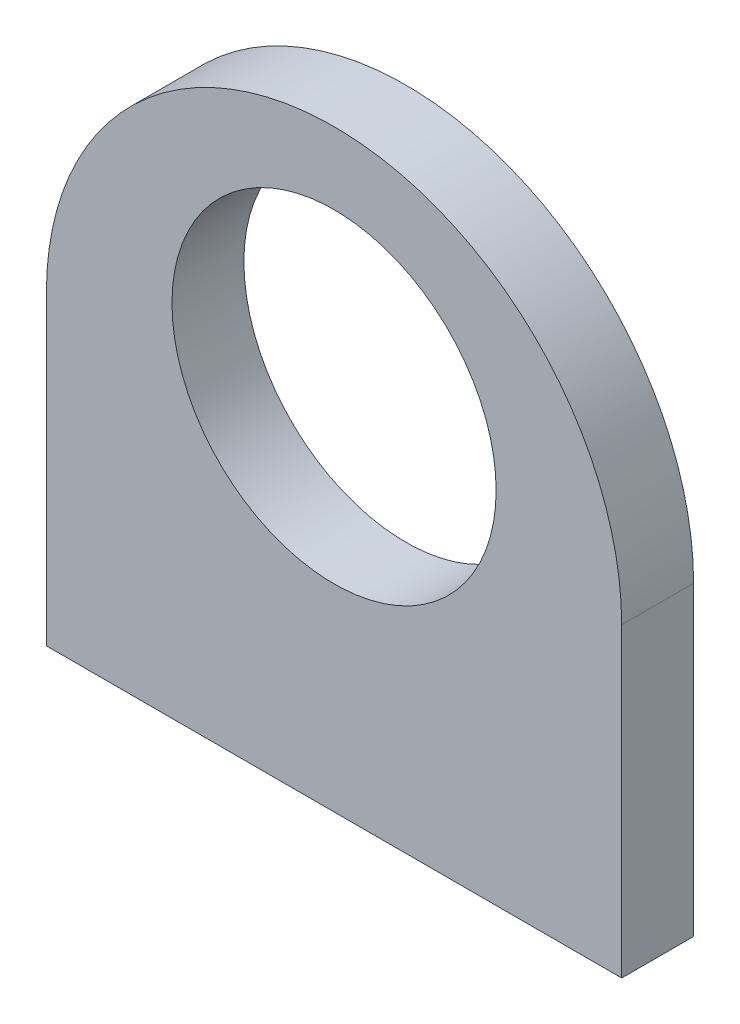
ISO-10303-21;
HEADER;
FILE_DESCRIPTION(('STEP AP214'),'2;1');
FILE_NAME('part.step','',(''),(''),'','','');
FILE_SCHEMA(('AUTOMOTIVE_DESIGN { 1 0 10303 214 1 1 1 1 }'));
ENDSEC;
DATA;
#1=APPLICATION_CONTEXT('core data for automotive mechanical design processes');
#2=APPLICATION_PROTOCOL_DEFINITION('international standard','automotive_design',2000,#1);
#3=PRODUCT_CONTEXT('',#1,'mechanical');
#4=PRODUCT('Part','Part','',(#3));
#5=PRODUCT_RELATED_PRODUCT_CATEGORY('part','',(#4));
#6=PRODUCT_DEFINITION_FORMATION('','',#4);
#7=PRODUCT_DEFINITION_CONTEXT('part definition',#1,'design');
#8=PRODUCT_DEFINITION('design','',#6,#7);
#9=PRODUCT_DEFINITION_SHAPE('','',#8);
#10=(LENGTH_UNIT() NAMED_UNIT(*) SI_UNIT(.MILLI.,.METRE.));
#11=(NAMED_UNIT(*) PLANE_ANGLE_UNIT() SI_UNIT($,.RADIAN.));
#12=(NAMED_UNIT(*) SI_UNIT($,.STERADIAN.) SOLID_ANGLE_UNIT());
#13=UNCERTAINTY_MEASURE_WITH_UNIT(LENGTH_MEASURE(1.E-05),#10,'distance_accuracy_value','');
#14=(GEOMETRIC_REPRESENTATION_CONTEXT(3) GLOBAL_UNCERTAINTY_ASSIGNED_CONTEXT((#13)) GLOBAL_UNIT_ASSIGNED_CONTEXT((#10,
#11,#12)) REPRESENTATION_CONTEXT('',''));
#15=CARTESIAN_POINT('',(0.,0.,0.));
#16=DIRECTION('',(0.,0.,1.));
#17=DIRECTION('',(1.,0.,0.));
#18=AXIS2_PLACEMENT_3D('',#15,#16,#17);
#19=CARTESIAN_POINT('',(25.4,27.0129,6.35));
#20=DIRECTION('',(0.,0.,1.));
#21=DIRECTION('',(1.,0.,0.));
#22=AXIS2_PLACEMENT_3D('',#19,#20,#21);
#23=PLANE('',#22);
#24=DIRECTION('',(0.,-1.,0.));
#25=VECTOR('',#24,1.);
#26=CARTESIAN_POINT('',(0.,0.,6.35));
#27=LINE('',#26,#25);
#28=CARTESIAN_POINT('',(0.,27.0129,6.35));
#29=VERTEX_POINT('',#28);
#30=CARTESIAN_POINT('',(0.,0.,6.35));
#31=VERTEX_POINT('',#30);
#32=EDGE_CURVE('E91',#29,#31,#27,.T.);
#33=ORIENTED_EDGE('',*,*,#32,.T.);
#34=DIRECTION('',(1.,0.,0.));
#35=VECTOR('',#34,1.);
#36=CARTESIAN_POINT('',(0.,0.,6.35));
#37=LINE('',#36,#35);
#38=CARTESIAN_POINT('',(50.8,0.,6.35));
#39=VERTEX_POINT('',#38);
#40=EDGE_CURVE('E86',#31,#39,#37,.T.);
#41=ORIENTED_EDGE('',*,*,#40,.T.);
#42=DIRECTION('',(0.,1.,0.));
#43=VECTOR('',#42,1.);
#44=CARTESIAN_POINT('',(50.8,0.,6.35));
#45=LINE('',#44,#43);
#46=CARTESIAN_POINT('',(50.8,27.0129,6.35));
#47=VERTEX_POINT('',#46);
#48=EDGE_CURVE('E89',#39,#47,#45,.T.);
#49=ORIENTED_EDGE('',*,*,#48,.T.);
#50=CARTESIAN_POINT('',(25.4,27.0129,6.35));
#51=DIRECTION('',(0.,0.,1.));
#52=DIRECTION('',(1.,0.,0.));
#53=AXIS2_PLACEMENT_3D('',#50,#51,#52);
#54=CIRCLE('',#53,25.4);
#55=EDGE_CURVE('E56',#47,#29,#54,.T.);
#56=ORIENTED_EDGE('',*,*,#55,.T.);
#57=EDGE_LOOP('',(#33,#41,#49,#56));
#58=FACE_BOUND('',#57,.T.);
#59=CARTESIAN_POINT('',(25.4,31.75,6.35));
#60=DIRECTION('',(0.,0.,1.));
#61=DIRECTION('',(1.,0.,0.));
#62=AXIS2_PLACEMENT_3D('',#59,#60,#61);
#63=CIRCLE('',#62,14.3129);
#64=CARTESIAN_POINT('',(39.7129,31.75,6.35));
#65=VERTEX_POINT('',#64);
#66=EDGE_CURVE('E106',#65,#65,#63,.T.);
#67=ORIENTED_EDGE('',*,*,#66,.F.);
#68=EDGE_LOOP('',(#67));
#69=FACE_BOUND('',#68,.T.);
#70=ADVANCED_FACE('F39',(#58,#69),#23,.T.);
#71=CARTESIAN_POINT('',(25.4,27.0129,0.));
#72=DIRECTION('',(0.,0.,1.));
#73=DIRECTION('',(1.,0.,0.));
#74=AXIS2_PLACEMENT_3D('',#71,#72,#73);
#75=PLANE('',#74);
#76=DIRECTION('',(0.,-1.,0.));
#77=VECTOR('',#76,1.);
#78=CARTESIAN_POINT('',(0.,0.,0.));
#79=LINE('',#78,#77);
#80=CARTESIAN_POINT('',(0.,27.0129,0.));
#81=VERTEX_POINT('',#80);
#82=CARTESIAN_POINT('',(0.,0.,0.));
#83=VERTEX_POINT('',#82);
#84=EDGE_CURVE('E103',#81,#83,#79,.T.);
#85=ORIENTED_EDGE('',*,*,#84,.F.);
#86=CARTESIAN_POINT('',(25.4,27.0129,0.));
#87=DIRECTION('',(0.,0.,1.));
#88=DIRECTION('',(1.,0.,0.));
#89=AXIS2_PLACEMENT_3D('',#86,#87,#88);
#90=CIRCLE('',#89,25.4);
#91=CARTESIAN_POINT('',(50.8,27.0129,0.));
#92=VERTEX_POINT('',#91);
#93=EDGE_CURVE('E79',#92,#81,#90,.T.);
#94=ORIENTED_EDGE('',*,*,#93,.F.);
#95=DIRECTION('',(0.,1.,0.));
#96=VECTOR('',#95,1.);
#97=CARTESIAN_POINT('',(50.8,0.,0.));
#98=LINE('',#97,#96);
#99=CARTESIAN_POINT('',(50.8,0.,0.));
#100=VERTEX_POINT('',#99);
#101=EDGE_CURVE('E73',#100,#92,#98,.T.);
#102=ORIENTED_EDGE('',*,*,#101,.F.);
#103=DIRECTION('',(1.,0.,0.));
#104=VECTOR('',#103,1.);
#105=CARTESIAN_POINT('',(0.,0.,0.));
#106=LINE('',#105,#104);
#107=EDGE_CURVE('E95',#83,#100,#106,.T.);
#108=ORIENTED_EDGE('',*,*,#107,.F.);
#109=EDGE_LOOP('',(#85,#94,#102,#108));
#110=FACE_BOUND('',#109,.T.);
#111=CARTESIAN_POINT('',(25.4,31.75,0.));
#112=DIRECTION('',(0.,0.,1.));
#113=DIRECTION('',(1.,0.,0.));
#114=AXIS2_PLACEMENT_3D('',#111,#112,#113);
#115=CIRCLE('',#114,14.3129);
#116=CARTESIAN_POINT('',(39.7129,31.75,0.));
#117=VERTEX_POINT('',#116);
#118=EDGE_CURVE('E118',#117,#117,#115,.T.);
#119=ORIENTED_EDGE('',*,*,#118,.T.);
#120=EDGE_LOOP('',(#119));
#121=FACE_BOUND('',#120,.T.);
#122=ADVANCED_FACE('F114',(#110,#121),#75,.F.);
#123=CARTESIAN_POINT('',(0.,0.,6.35));
#124=DIRECTION('',(1.,0.,0.));
#125=DIRECTION('',(0.,0.,-1.));
#126=AXIS2_PLACEMENT_3D('',#123,#124,#125);
#127=PLANE('',#126);
#128=ORIENTED_EDGE('',*,*,#84,.T.);
#129=DIRECTION('',(0.,0.,-1.));
#130=VECTOR('',#129,1.);
#131=CARTESIAN_POINT('',(0.,0.,6.35));
#132=LINE('',#131,#130);
#133=EDGE_CURVE('E11',#31,#83,#132,.T.);
#134=ORIENTED_EDGE('',*,*,#133,.F.);
#135=ORIENTED_EDGE('',*,*,#32,.F.);
#136=DIRECTION('',(0.,0.,-1.));
#137=VECTOR('',#136,1.);
#138=CARTESIAN_POINT('',(0.,27.0129,6.35));
#139=LINE('',#138,#137);
#140=EDGE_CURVE('E99',#29,#81,#139,.T.);
#141=ORIENTED_EDGE('',*,*,#140,.T.);
#142=EDGE_LOOP('',(#128,#134,#135,#141));
#143=FACE_BOUND('',#142,.T.);
#144=ADVANCED_FACE('F41',(#143),#127,.F.);
#145=CARTESIAN_POINT('',(0.,0.,6.35));
#146=DIRECTION('',(0.,1.,0.));
#147=DIRECTION('',(0.,0.,1.));
#148=AXIS2_PLACEMENT_3D('',#145,#146,#147);
#149=PLANE('',#148);
#150=ORIENTED_EDGE('',*,*,#107,.T.);
#151=DIRECTION('',(0.,0.,-1.));
#152=VECTOR('',#151,1.);
#153=CARTESIAN_POINT('',(50.8,0.,6.35));
#154=LINE('',#153,#152);
#155=EDGE_CURVE('E48',#39,#100,#154,.T.);
#156=ORIENTED_EDGE('',*,*,#155,.F.);
#157=ORIENTED_EDGE('',*,*,#40,.F.);
#158=ORIENTED_EDGE('',*,*,#133,.T.);
#159=EDGE_LOOP('',(#150,#156,#157,#158));
#160=FACE_BOUND('',#159,.T.);
#161=ADVANCED_FACE('F94',(#160),#149,.F.);
#162=CARTESIAN_POINT('',(50.8,0.,6.35));
#163=DIRECTION('',(-1.,0.,0.));
#164=DIRECTION('',(0.,-1.,0.));
#165=AXIS2_PLACEMENT_3D('',#162,#163,#164);
#166=PLANE('',#165);
#167=ORIENTED_EDGE('',*,*,#101,.T.);
#168=DIRECTION('',(0.,0.,-1.));
#169=VECTOR('',#168,1.);
#170=CARTESIAN_POINT('',(50.8,27.0129,6.35));
#171=LINE('',#170,#169);
#172=EDGE_CURVE('E96',#47,#92,#171,.T.);
#173=ORIENTED_EDGE('',*,*,#172,.F.);
#174=ORIENTED_EDGE('',*,*,#48,.F.);
#175=ORIENTED_EDGE('',*,*,#155,.T.);
#176=EDGE_LOOP('',(#167,#173,#174,#175));
#177=FACE_BOUND('',#176,.T.);
#178=ADVANCED_FACE('F97',(#177),#166,.F.);
#179=CARTESIAN_POINT('',(25.4,27.0129,6.35));
#180=DIRECTION('',(0.,0.,-1.));
#181=DIRECTION('',(-1.,0.,0.));
#182=AXIS2_PLACEMENT_3D('',#179,#180,#181);
#183=CYLINDRICAL_SURFACE('',#182,25.4);
#184=ORIENTED_EDGE('',*,*,#93,.T.);
#185=ORIENTED_EDGE('',*,*,#140,.F.);
#186=ORIENTED_EDGE('',*,*,#55,.F.);
#187=ORIENTED_EDGE('',*,*,#172,.T.);
#188=EDGE_LOOP('',(#184,#185,#186,#187));
#189=FACE_BOUND('',#188,.T.);
#190=ADVANCED_FACE('F111',(#189),#183,.T.);
#191=CARTESIAN_POINT('',(25.4,31.75,6.35));
#192=DIRECTION('',(0.,0.,-1.));
#193=DIRECTION('',(-1.,0.,0.));
#194=AXIS2_PLACEMENT_3D('',#191,#192,#193);
#195=CYLINDRICAL_SURFACE('',#194,14.3129);
#196=ORIENTED_EDGE('',*,*,#66,.T.);
#197=EDGE_LOOP('',(#196));
#198=FACE_BOUND('',#197,.T.);
#199=ORIENTED_EDGE('',*,*,#118,.F.);
#200=EDGE_LOOP('',(#199));
#201=FACE_BOUND('',#200,.T.);
#202=ADVANCED_FACE('F124',(#198,#201),#195,.F.);
#203=CLOSED_SHELL('',(#70,#122,#144,#161,#178,#190,#202));
#204=MANIFOLD_SOLID_BREP('B2',#203);
#205=ADVANCED_BREP_SHAPE_REPRESENTATION('',(#18,#204),#14);
#206=SHAPE_DEFINITION_REPRESENTATION(#9,#205);
ENDSEC;
END-ISO-10303-21;
